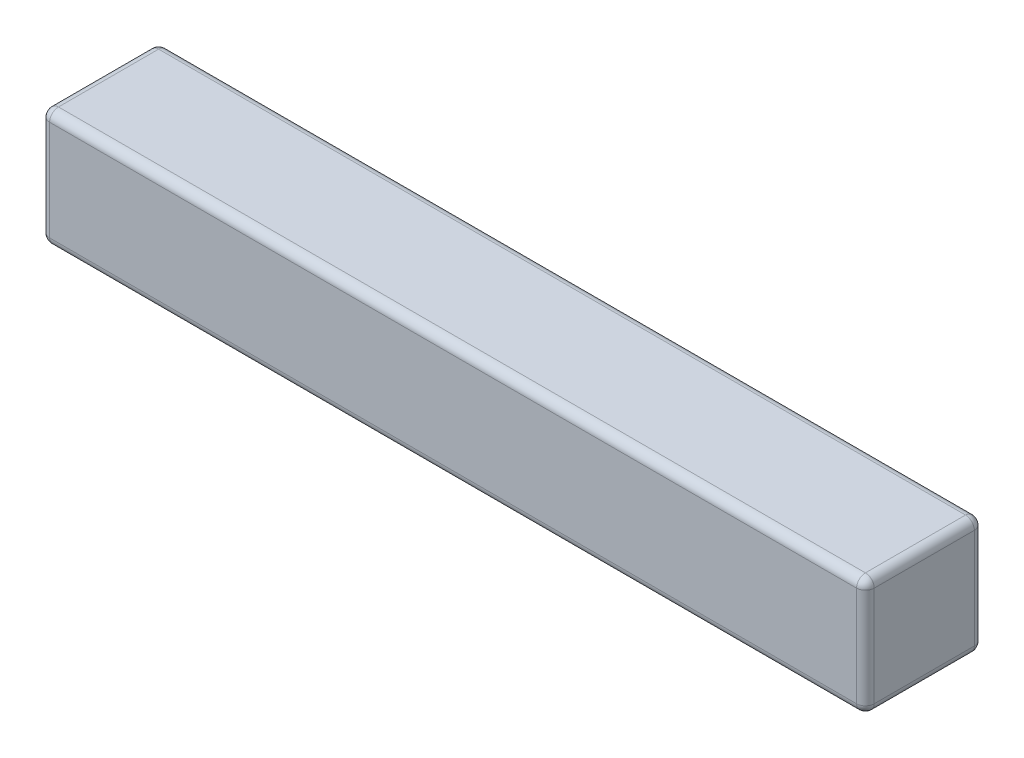
ISO-10303-21;
HEADER;
FILE_DESCRIPTION(('STEP AP214'),'2;1');
FILE_NAME('part.step','',(''),(''),'','','');
FILE_SCHEMA(('AUTOMOTIVE_DESIGN { 1 0 10303 214 1 1 1 1 }'));
ENDSEC;
DATA;
#1=APPLICATION_CONTEXT('core data for automotive mechanical design processes');
#2=APPLICATION_PROTOCOL_DEFINITION('international standard','automotive_design',2000,#1);
#3=PRODUCT_CONTEXT('',#1,'mechanical');
#4=PRODUCT('Part','Part','',(#3));
#5=PRODUCT_RELATED_PRODUCT_CATEGORY('part','',(#4));
#6=PRODUCT_DEFINITION_FORMATION('','',#4);
#7=PRODUCT_DEFINITION_CONTEXT('part definition',#1,'design');
#8=PRODUCT_DEFINITION('design','',#6,#7);
#9=PRODUCT_DEFINITION_SHAPE('','',#8);
#10=(LENGTH_UNIT() NAMED_UNIT(*) SI_UNIT(.MILLI.,.METRE.));
#11=(NAMED_UNIT(*) PLANE_ANGLE_UNIT() SI_UNIT($,.RADIAN.));
#12=(NAMED_UNIT(*) SI_UNIT($,.STERADIAN.) SOLID_ANGLE_UNIT());
#13=UNCERTAINTY_MEASURE_WITH_UNIT(LENGTH_MEASURE(1.E-05),#10,'distance_accuracy_value','');
#14=(GEOMETRIC_REPRESENTATION_CONTEXT(3) GLOBAL_UNCERTAINTY_ASSIGNED_CONTEXT((#13)) GLOBAL_UNIT_ASSIGNED_CONTEXT((#10,
#11,#12)) REPRESENTATION_CONTEXT('',''));
#15=CARTESIAN_POINT('',(0.,0.,0.));
#16=DIRECTION('',(0.,0.,1.));
#17=DIRECTION('',(1.,0.,0.));
#18=AXIS2_PLACEMENT_3D('',#15,#16,#17);
#19=CARTESIAN_POINT('',(13.85,-1.85,-3.2542396313364));
#20=DIRECTION('',(1.,0.,0.));
#21=DIRECTION('',(0.,1.,0.));
#22=AXIS2_PLACEMENT_3D('',#19,#20,#21);
#23=SPHERICAL_SURFACE('',#22,0.15);
#24=CARTESIAN_POINT('',(13.85,-1.85,-3.2542396313364));
#25=DIRECTION('',(-1.,0.,0.));
#26=DIRECTION('',(0.,0.,1.));
#27=AXIS2_PLACEMENT_3D('',#24,#25,#26);
#28=CIRCLE('',#27,0.15);
#29=CARTESIAN_POINT('',(13.85,-1.85,-3.4042396313364));
#30=VERTEX_POINT('',#29);
#31=CARTESIAN_POINT('',(13.85,-2.,-3.25423963133563));
#32=VERTEX_POINT('',#31);
#33=EDGE_CURVE('E464',#30,#32,#28,.T.);
#34=ORIENTED_EDGE('',*,*,#33,.F.);
#35=CARTESIAN_POINT('',(13.85,-1.85,-3.2542396313364));
#36=DIRECTION('',(0.,-1.,0.));
#37=DIRECTION('',(0.,0.,-1.));
#38=AXIS2_PLACEMENT_3D('',#35,#36,#37);
#39=CIRCLE('',#38,0.15);
#40=CARTESIAN_POINT('',(14.,-1.85,-3.2542396313364));
#41=VERTEX_POINT('',#40);
#42=EDGE_CURVE('E461',#41,#30,#39,.F.);
#43=ORIENTED_EDGE('',*,*,#42,.F.);
#44=CARTESIAN_POINT('',(13.85,-1.85,-3.2542396313364));
#45=DIRECTION('',(0.,0.,-1.));
#46=DIRECTION('',(-1.,0.,0.));
#47=AXIS2_PLACEMENT_3D('',#44,#45,#46);
#48=CIRCLE('',#47,0.15);
#49=EDGE_CURVE('E102',#32,#41,#48,.F.);
#50=ORIENTED_EDGE('',*,*,#49,.F.);
#51=EDGE_LOOP('',(#34,#43,#50));
#52=FACE_BOUND('',#51,.T.);
#53=ADVANCED_FACE('F16',(#52),#23,.T.);
#54=CARTESIAN_POINT('',(0.15,-1.85,-3.2542396313364));
#55=DIRECTION('',(1.,0.,0.));
#56=DIRECTION('',(0.,1.,0.));
#57=AXIS2_PLACEMENT_3D('',#54,#55,#56);
#58=SPHERICAL_SURFACE('',#57,0.15);
#59=CARTESIAN_POINT('',(0.15,-1.85,-3.2542396313364));
#60=DIRECTION('',(0.,0.,1.));
#61=DIRECTION('',(1.,0.,0.));
#62=AXIS2_PLACEMENT_3D('',#59,#60,#61);
#63=CIRCLE('',#62,0.15);
#64=CARTESIAN_POINT('',(0.,-1.85,-3.2542396313364));
#65=VERTEX_POINT('',#64);
#66=CARTESIAN_POINT('',(0.150000000000001,-2.,-3.2542396313364));
#67=VERTEX_POINT('',#66);
#68=EDGE_CURVE('E476',#65,#67,#63,.T.);
#69=ORIENTED_EDGE('',*,*,#68,.F.);
#70=CARTESIAN_POINT('',(0.150000000000001,-1.85,-3.2542396313364));
#71=DIRECTION('',(0.,-1.,0.));
#72=DIRECTION('',(0.,0.,-1.));
#73=AXIS2_PLACEMENT_3D('',#70,#71,#72);
#74=CIRCLE('',#73,0.15);
#75=CARTESIAN_POINT('',(0.150000000000001,-1.85000000000077,-3.4042396313364));
#76=VERTEX_POINT('',#75);
#77=EDGE_CURVE('E409',#76,#65,#74,.F.);
#78=ORIENTED_EDGE('',*,*,#77,.F.);
#79=CARTESIAN_POINT('',(0.150000000000001,-1.85,-3.2542396313364));
#80=DIRECTION('',(-1.,0.,0.));
#81=DIRECTION('',(0.,0.,1.));
#82=AXIS2_PLACEMENT_3D('',#79,#80,#81);
#83=CIRCLE('',#82,0.15);
#84=EDGE_CURVE('E465',#67,#76,#83,.F.);
#85=ORIENTED_EDGE('',*,*,#84,.F.);
#86=EDGE_LOOP('',(#69,#78,#85));
#87=FACE_BOUND('',#86,.T.);
#88=ADVANCED_FACE('F156',(#87),#58,.T.);
#89=CARTESIAN_POINT('',(13.85,-1.85,-1.5542396313364));
#90=DIRECTION('',(1.,0.,0.));
#91=DIRECTION('',(0.,1.,0.));
#92=AXIS2_PLACEMENT_3D('',#89,#90,#91);
#93=SPHERICAL_SURFACE('',#92,0.15);
#94=CARTESIAN_POINT('',(13.85,-1.85,-1.5542396313364));
#95=DIRECTION('',(1.,0.,0.));
#96=DIRECTION('',(0.,0.,-1.));
#97=AXIS2_PLACEMENT_3D('',#94,#95,#96);
#98=CIRCLE('',#97,0.15);
#99=CARTESIAN_POINT('',(13.85,-2.,-1.5542396313364));
#100=VERTEX_POINT('',#99);
#101=CARTESIAN_POINT('',(13.85,-1.84999999999923,-1.4042396313364));
#102=VERTEX_POINT('',#101);
#103=EDGE_CURVE('E127',#100,#102,#98,.F.);
#104=ORIENTED_EDGE('',*,*,#103,.F.);
#105=CARTESIAN_POINT('',(13.85,-1.85,-1.5542396313364));
#106=DIRECTION('',(0.,0.,-1.));
#107=DIRECTION('',(-1.,0.,0.));
#108=AXIS2_PLACEMENT_3D('',#105,#106,#107);
#109=CIRCLE('',#108,0.15);
#110=CARTESIAN_POINT('',(14.,-1.85,-1.5542396313364));
#111=VERTEX_POINT('',#110);
#112=EDGE_CURVE('E119',#111,#100,#109,.T.);
#113=ORIENTED_EDGE('',*,*,#112,.F.);
#114=CARTESIAN_POINT('',(13.85,-1.85,-1.5542396313364));
#115=DIRECTION('',(0.,-1.,0.));
#116=DIRECTION('',(0.,0.,-1.));
#117=AXIS2_PLACEMENT_3D('',#114,#115,#116);
#118=CIRCLE('',#117,0.15);
#119=EDGE_CURVE('E136',#102,#111,#118,.F.);
#120=ORIENTED_EDGE('',*,*,#119,.F.);
#121=EDGE_LOOP('',(#104,#113,#120));
#122=FACE_BOUND('',#121,.T.);
#123=ADVANCED_FACE('F133',(#122),#93,.T.);
#124=CARTESIAN_POINT('',(0.15,-1.85,-1.5542396313364));
#125=DIRECTION('',(1.,0.,0.));
#126=DIRECTION('',(0.,1.,0.));
#127=AXIS2_PLACEMENT_3D('',#124,#125,#126);
#128=SPHERICAL_SURFACE('',#127,0.15);
#129=CARTESIAN_POINT('',(0.15,-1.85,-1.5542396313364));
#130=DIRECTION('',(1.,0.,0.));
#131=DIRECTION('',(0.,0.,-1.));
#132=AXIS2_PLACEMENT_3D('',#129,#130,#131);
#133=CIRCLE('',#132,0.15);
#134=CARTESIAN_POINT('',(0.15,-1.85,-1.4042396313364));
#135=VERTEX_POINT('',#134);
#136=CARTESIAN_POINT('',(0.15,-2.,-1.55423963133602));
#137=VERTEX_POINT('',#136);
#138=EDGE_CURVE('E129',#135,#137,#133,.T.);
#139=ORIENTED_EDGE('',*,*,#138,.F.);
#140=CARTESIAN_POINT('',(0.15,-1.85,-1.5542396313364));
#141=DIRECTION('',(0.,-1.,0.));
#142=DIRECTION('',(0.,0.,-1.));
#143=AXIS2_PLACEMENT_3D('',#140,#141,#142);
#144=CIRCLE('',#143,0.15);
#145=CARTESIAN_POINT('',(0.,-1.85,-1.5542396313364));
#146=VERTEX_POINT('',#145);
#147=EDGE_CURVE('E138',#146,#135,#144,.F.);
#148=ORIENTED_EDGE('',*,*,#147,.F.);
#149=CARTESIAN_POINT('',(0.15,-1.85,-1.5542396313364));
#150=DIRECTION('',(0.,0.,1.));
#151=DIRECTION('',(1.,0.,0.));
#152=AXIS2_PLACEMENT_3D('',#149,#150,#151);
#153=CIRCLE('',#152,0.15);
#154=EDGE_CURVE('E468',#137,#146,#153,.F.);
#155=ORIENTED_EDGE('',*,*,#154,.F.);
#156=EDGE_LOOP('',(#139,#148,#155));
#157=FACE_BOUND('',#156,.T.);
#158=ADVANCED_FACE('F149',(#157),#128,.T.);
#159=CARTESIAN_POINT('',(0.,-2.,-1.4042396313364));
#160=DIRECTION('',(0.,1.,0.));
#161=DIRECTION('',(0.,0.,1.));
#162=AXIS2_PLACEMENT_3D('',#159,#160,#161);
#163=PLANE('',#162);
#164=DIRECTION('',(-1.,0.,0.));
#165=VECTOR('',#164,1.);
#166=CARTESIAN_POINT('',(14.,-2.,-3.2542396313364));
#167=LINE('',#166,#165);
#168=EDGE_CURVE('E116',#32,#67,#167,.T.);
#169=ORIENTED_EDGE('',*,*,#168,.F.);
#170=DIRECTION('',(0.,0.,-1.));
#171=VECTOR('',#170,1.);
#172=CARTESIAN_POINT('',(13.85,-2.,-1.4042396313364));
#173=LINE('',#172,#171);
#174=EDGE_CURVE('E109',#100,#32,#173,.T.);
#175=ORIENTED_EDGE('',*,*,#174,.F.);
#176=DIRECTION('',(1.,0.,0.));
#177=VECTOR('',#176,1.);
#178=CARTESIAN_POINT('',(0.,-2.,-1.5542396313364));
#179=LINE('',#178,#177);
#180=EDGE_CURVE('E113',#137,#100,#179,.T.);
#181=ORIENTED_EDGE('',*,*,#180,.F.);
#182=DIRECTION('',(0.,0.,1.));
#183=VECTOR('',#182,1.);
#184=CARTESIAN_POINT('',(0.15,-2.,-3.4042396313364));
#185=LINE('',#184,#183);
#186=EDGE_CURVE('E478',#67,#137,#185,.T.);
#187=ORIENTED_EDGE('',*,*,#186,.F.);
#188=EDGE_LOOP('',(#169,#175,#181,#187));
#189=FACE_BOUND('',#188,.T.);
#190=ADVANCED_FACE('F111',(#189),#163,.F.);
#191=CARTESIAN_POINT('',(13.85,-1.85,-1.4042396313364));
#192=DIRECTION('',(0.,0.,-1.));
#193=DIRECTION('',(-1.,0.,0.));
#194=AXIS2_PLACEMENT_3D('',#191,#192,#193);
#195=CYLINDRICAL_SURFACE('',#194,0.15);
#196=ORIENTED_EDGE('',*,*,#49,.T.);
#197=DIRECTION('',(0.,0.,-1.));
#198=VECTOR('',#197,1.);
#199=CARTESIAN_POINT('',(14.,-1.85,-1.4042396313364));
#200=LINE('',#199,#198);
#201=EDGE_CURVE('E130',#111,#41,#200,.T.);
#202=ORIENTED_EDGE('',*,*,#201,.F.);
#203=ORIENTED_EDGE('',*,*,#112,.T.);
#204=ORIENTED_EDGE('',*,*,#174,.T.);
#205=EDGE_LOOP('',(#196,#202,#203,#204));
#206=FACE_BOUND('',#205,.T.);
#207=ADVANCED_FACE('F140',(#206),#195,.T.);
#208=CARTESIAN_POINT('',(13.85,-2.,-3.2542396313364));
#209=DIRECTION('',(0.,-1.,0.));
#210=DIRECTION('',(0.,0.,-1.));
#211=AXIS2_PLACEMENT_3D('',#208,#209,#210);
#212=CYLINDRICAL_SURFACE('',#211,0.15);
#213=CARTESIAN_POINT('',(13.85,-0.15,-3.2542396313364));
#214=DIRECTION('',(0.,1.,0.));
#215=DIRECTION('',(1.,0.,0.));
#216=AXIS2_PLACEMENT_3D('',#213,#214,#215);
#217=CIRCLE('',#216,0.15);
#218=CARTESIAN_POINT('',(14.,-0.15,-3.2542396313364));
#219=VERTEX_POINT('',#218);
#220=CARTESIAN_POINT('',(13.85,-0.15,-3.4042396313364));
#221=VERTEX_POINT('',#220);
#222=EDGE_CURVE('E243',#219,#221,#217,.T.);
#223=ORIENTED_EDGE('',*,*,#222,.F.);
#224=DIRECTION('',(0.,1.,0.));
#225=VECTOR('',#224,1.);
#226=CARTESIAN_POINT('',(14.,-2.,-3.2542396313364));
#227=LINE('',#226,#225);
#228=EDGE_CURVE('E443',#41,#219,#227,.T.);
#229=ORIENTED_EDGE('',*,*,#228,.F.);
#230=ORIENTED_EDGE('',*,*,#42,.T.);
#231=DIRECTION('',(0.,1.,0.));
#232=VECTOR('',#231,1.);
#233=CARTESIAN_POINT('',(13.85,-2.,-3.4042396313364));
#234=LINE('',#233,#232);
#235=EDGE_CURVE('E237',#221,#30,#234,.F.);
#236=ORIENTED_EDGE('',*,*,#235,.F.);
#237=EDGE_LOOP('',(#223,#229,#230,#236));
#238=FACE_BOUND('',#237,.T.);
#239=ADVANCED_FACE('F276',(#238),#212,.T.);
#240=CARTESIAN_POINT('',(14.,-1.85,-3.2542396313364));
#241=DIRECTION('',(-1.,0.,0.));
#242=DIRECTION('',(0.,0.,1.));
#243=AXIS2_PLACEMENT_3D('',#240,#241,#242);
#244=CYLINDRICAL_SURFACE('',#243,0.15);
#245=ORIENTED_EDGE('',*,*,#84,.T.);
#246=DIRECTION('',(-1.,0.,0.));
#247=VECTOR('',#246,1.);
#248=CARTESIAN_POINT('',(14.,-1.85,-3.4042396313364));
#249=LINE('',#248,#247);
#250=EDGE_CURVE('E234',#30,#76,#249,.T.);
#251=ORIENTED_EDGE('',*,*,#250,.F.);
#252=ORIENTED_EDGE('',*,*,#33,.T.);
#253=ORIENTED_EDGE('',*,*,#168,.T.);
#254=EDGE_LOOP('',(#245,#251,#252,#253));
#255=FACE_BOUND('',#254,.T.);
#256=ADVANCED_FACE('F272',(#255),#244,.T.);
#257=CARTESIAN_POINT('',(0.150000000000001,-2.,-3.2542396313364));
#258=DIRECTION('',(0.,-1.,0.));
#259=DIRECTION('',(0.,0.,-1.));
#260=AXIS2_PLACEMENT_3D('',#257,#258,#259);
#261=CYLINDRICAL_SURFACE('',#260,0.15);
#262=CARTESIAN_POINT('',(0.15,-0.15,-3.2542396313364));
#263=DIRECTION('',(0.,1.,0.));
#264=DIRECTION('',(1.,0.,0.));
#265=AXIS2_PLACEMENT_3D('',#262,#263,#264);
#266=CIRCLE('',#265,0.15);
#267=CARTESIAN_POINT('',(0.150000000000001,-0.15,-3.4042396313364));
#268=VERTEX_POINT('',#267);
#269=CARTESIAN_POINT('',(0.,-0.15,-3.2542396313364));
#270=VERTEX_POINT('',#269);
#271=EDGE_CURVE('E231',#268,#270,#266,.T.);
#272=ORIENTED_EDGE('',*,*,#271,.F.);
#273=DIRECTION('',(0.,1.,0.));
#274=VECTOR('',#273,1.);
#275=CARTESIAN_POINT('',(0.150000000000001,-2.,-3.4042396313364));
#276=LINE('',#275,#274);
#277=EDGE_CURVE('E240',#76,#268,#276,.T.);
#278=ORIENTED_EDGE('',*,*,#277,.F.);
#279=ORIENTED_EDGE('',*,*,#77,.T.);
#280=DIRECTION('',(0.,1.,0.));
#281=VECTOR('',#280,1.);
#282=CARTESIAN_POINT('',(0.,-2.,-3.2542396313364));
#283=LINE('',#282,#281);
#284=EDGE_CURVE('E229',#270,#65,#283,.F.);
#285=ORIENTED_EDGE('',*,*,#284,.F.);
#286=EDGE_LOOP('',(#272,#278,#279,#285));
#287=FACE_BOUND('',#286,.T.);
#288=ADVANCED_FACE('F268',(#287),#261,.T.);
#289=CARTESIAN_POINT('',(0.15,-1.85,-3.4042396313364));
#290=DIRECTION('',(0.,0.,1.));
#291=DIRECTION('',(1.,0.,0.));
#292=AXIS2_PLACEMENT_3D('',#289,#290,#291);
#293=CYLINDRICAL_SURFACE('',#292,0.15);
#294=ORIENTED_EDGE('',*,*,#68,.T.);
#295=ORIENTED_EDGE('',*,*,#186,.T.);
#296=ORIENTED_EDGE('',*,*,#154,.T.);
#297=DIRECTION('',(0.,0.,1.));
#298=VECTOR('',#297,1.);
#299=CARTESIAN_POINT('',(0.,-1.85,-3.4042396313364));
#300=LINE('',#299,#298);
#301=EDGE_CURVE('E399',#65,#146,#300,.T.);
#302=ORIENTED_EDGE('',*,*,#301,.F.);
#303=EDGE_LOOP('',(#294,#295,#296,#302));
#304=FACE_BOUND('',#303,.T.);
#305=ADVANCED_FACE('F264',(#304),#293,.T.);
#306=CARTESIAN_POINT('',(13.85,-2.,-1.5542396313364));
#307=DIRECTION('',(0.,-1.,0.));
#308=DIRECTION('',(0.,0.,-1.));
#309=AXIS2_PLACEMENT_3D('',#306,#307,#308);
#310=CYLINDRICAL_SURFACE('',#309,0.15);
#311=CARTESIAN_POINT('',(13.85,-0.15,-1.5542396313364));
#312=DIRECTION('',(0.,-1.,0.));
#313=DIRECTION('',(0.,0.,-1.));
#314=AXIS2_PLACEMENT_3D('',#311,#312,#313);
#315=CIRCLE('',#314,0.15);
#316=CARTESIAN_POINT('',(14.,-0.15,-1.5542396313364));
#317=VERTEX_POINT('',#316);
#318=CARTESIAN_POINT('',(13.85,-0.15,-1.4042396313364));
#319=VERTEX_POINT('',#318);
#320=EDGE_CURVE('E438',#317,#319,#315,.T.);
#321=ORIENTED_EDGE('',*,*,#320,.T.);
#322=DIRECTION('',(0.,1.,0.));
#323=VECTOR('',#322,1.);
#324=CARTESIAN_POINT('',(13.85,-2.,-1.4042396313364));
#325=LINE('',#324,#323);
#326=EDGE_CURVE('E205',#102,#319,#325,.T.);
#327=ORIENTED_EDGE('',*,*,#326,.F.);
#328=ORIENTED_EDGE('',*,*,#119,.T.);
#329=DIRECTION('',(0.,1.,0.));
#330=VECTOR('',#329,1.);
#331=CARTESIAN_POINT('',(14.,-2.,-1.5542396313364));
#332=LINE('',#331,#330);
#333=EDGE_CURVE('E442',#317,#111,#332,.F.);
#334=ORIENTED_EDGE('',*,*,#333,.F.);
#335=EDGE_LOOP('',(#321,#327,#328,#334));
#336=FACE_BOUND('',#335,.T.);
#337=ADVANCED_FACE('F260',(#336),#310,.T.);
#338=CARTESIAN_POINT('',(0.15,-2.,-1.5542396313364));
#339=DIRECTION('',(0.,-1.,0.));
#340=DIRECTION('',(0.,0.,-1.));
#341=AXIS2_PLACEMENT_3D('',#338,#339,#340);
#342=CYLINDRICAL_SURFACE('',#341,0.15);
#343=CARTESIAN_POINT('',(0.15,-0.15,-1.5542396313364));
#344=DIRECTION('',(0.,-1.,0.));
#345=DIRECTION('',(1.,0.,0.));
#346=AXIS2_PLACEMENT_3D('',#343,#344,#345);
#347=CIRCLE('',#346,0.15);
#348=CARTESIAN_POINT('',(0.,-0.15,-1.5542396313364));
#349=VERTEX_POINT('',#348);
#350=CARTESIAN_POINT('',(0.15,-0.15,-1.4042396313364));
#351=VERTEX_POINT('',#350);
#352=EDGE_CURVE('E208',#349,#351,#347,.F.);
#353=ORIENTED_EDGE('',*,*,#352,.F.);
#354=DIRECTION('',(0.,1.,0.));
#355=VECTOR('',#354,1.);
#356=CARTESIAN_POINT('',(0.,-2.,-1.5542396313364));
#357=LINE('',#356,#355);
#358=EDGE_CURVE('E398',#146,#349,#357,.T.);
#359=ORIENTED_EDGE('',*,*,#358,.F.);
#360=ORIENTED_EDGE('',*,*,#147,.T.);
#361=DIRECTION('',(0.,1.,0.));
#362=VECTOR('',#361,1.);
#363=CARTESIAN_POINT('',(0.15,-2.,-1.4042396313364));
#364=LINE('',#363,#362);
#365=EDGE_CURVE('E202',#351,#135,#364,.F.);
#366=ORIENTED_EDGE('',*,*,#365,.F.);
#367=EDGE_LOOP('',(#353,#359,#360,#366));
#368=FACE_BOUND('',#367,.T.);
#369=ADVANCED_FACE('F257',(#368),#342,.T.);
#370=CARTESIAN_POINT('',(0.,-1.85,-1.5542396313364));
#371=DIRECTION('',(1.,0.,0.));
#372=DIRECTION('',(0.,0.,-1.));
#373=AXIS2_PLACEMENT_3D('',#370,#371,#372);
#374=CYLINDRICAL_SURFACE('',#373,0.15);
#375=ORIENTED_EDGE('',*,*,#138,.T.);
#376=ORIENTED_EDGE('',*,*,#180,.T.);
#377=ORIENTED_EDGE('',*,*,#103,.T.);
#378=DIRECTION('',(1.,0.,0.));
#379=VECTOR('',#378,1.);
#380=CARTESIAN_POINT('',(0.,-1.85,-1.4042396313364));
#381=LINE('',#380,#379);
#382=EDGE_CURVE('E200',#135,#102,#381,.T.);
#383=ORIENTED_EDGE('',*,*,#382,.F.);
#384=EDGE_LOOP('',(#375,#376,#377,#383));
#385=FACE_BOUND('',#384,.T.);
#386=ADVANCED_FACE('F125',(#385),#374,.T.);
#387=CARTESIAN_POINT('',(14.,-2.,-1.4042396313364));
#388=DIRECTION('',(1.,0.,0.));
#389=DIRECTION('',(0.,0.,-1.));
#390=AXIS2_PLACEMENT_3D('',#387,#388,#389);
#391=PLANE('',#390);
#392=DIRECTION('',(0.,0.,1.));
#393=VECTOR('',#392,1.);
#394=CARTESIAN_POINT('',(14.,-0.15,-1.4042396313364));
#395=LINE('',#394,#393);
#396=EDGE_CURVE('E428',#317,#219,#395,.F.);
#397=ORIENTED_EDGE('',*,*,#396,.F.);
#398=ORIENTED_EDGE('',*,*,#333,.T.);
#399=ORIENTED_EDGE('',*,*,#201,.T.);
#400=ORIENTED_EDGE('',*,*,#228,.T.);
#401=EDGE_LOOP('',(#397,#398,#399,#400));
#402=FACE_BOUND('',#401,.T.);
#403=ADVANCED_FACE('F250',(#402),#391,.T.);
#404=CARTESIAN_POINT('',(13.85,-0.15,-3.2542396313364));
#405=DIRECTION('',(1.,0.,0.));
#406=DIRECTION('',(0.,1.,0.));
#407=AXIS2_PLACEMENT_3D('',#404,#405,#406);
#408=SPHERICAL_SURFACE('',#407,0.15);
#409=ORIENTED_EDGE('',*,*,#222,.T.);
#410=CARTESIAN_POINT('',(13.85,-0.15,-3.2542396313364));
#411=DIRECTION('',(1.,0.,0.));
#412=DIRECTION('',(0.,0.,-1.));
#413=AXIS2_PLACEMENT_3D('',#410,#411,#412);
#414=CIRCLE('',#413,0.15);
#415=CARTESIAN_POINT('',(13.85,0.,-3.2542396313364));
#416=VERTEX_POINT('',#415);
#417=EDGE_CURVE('E421',#416,#221,#414,.F.);
#418=ORIENTED_EDGE('',*,*,#417,.F.);
#419=CARTESIAN_POINT('',(13.85,-0.15,-3.2542396313364));
#420=DIRECTION('',(0.,0.,1.));
#421=DIRECTION('',(1.,0.,0.));
#422=AXIS2_PLACEMENT_3D('',#419,#420,#421);
#423=CIRCLE('',#422,0.15);
#424=EDGE_CURVE('E423',#219,#416,#423,.T.);
#425=ORIENTED_EDGE('',*,*,#424,.F.);
#426=EDGE_LOOP('',(#409,#418,#425));
#427=FACE_BOUND('',#426,.T.);
#428=ADVANCED_FACE('F247',(#427),#408,.T.);
#429=CARTESIAN_POINT('',(14.,-2.,-3.4042396313364));
#430=DIRECTION('',(0.,0.,-1.));
#431=DIRECTION('',(-1.,0.,0.));
#432=AXIS2_PLACEMENT_3D('',#429,#430,#431);
#433=PLANE('',#432);
#434=ORIENTED_EDGE('',*,*,#235,.T.);
#435=ORIENTED_EDGE('',*,*,#250,.T.);
#436=ORIENTED_EDGE('',*,*,#277,.T.);
#437=DIRECTION('',(1.,0.,0.));
#438=VECTOR('',#437,1.);
#439=CARTESIAN_POINT('',(0.,-0.15,-3.4042396313364));
#440=LINE('',#439,#438);
#441=EDGE_CURVE('E417',#221,#268,#440,.F.);
#442=ORIENTED_EDGE('',*,*,#441,.F.);
#443=EDGE_LOOP('',(#434,#435,#436,#442));
#444=FACE_BOUND('',#443,.T.);
#445=ADVANCED_FACE('F223',(#444),#433,.T.);
#446=CARTESIAN_POINT('',(0.15,-0.15,-3.2542396313364));
#447=DIRECTION('',(1.,0.,0.));
#448=DIRECTION('',(0.,1.,0.));
#449=AXIS2_PLACEMENT_3D('',#446,#447,#448);
#450=SPHERICAL_SURFACE('',#449,0.15);
#451=CARTESIAN_POINT('',(0.15,-0.15,-3.2542396313364));
#452=DIRECTION('',(0.,0.,-1.));
#453=DIRECTION('',(-1.,0.,0.));
#454=AXIS2_PLACEMENT_3D('',#451,#452,#453);
#455=CIRCLE('',#454,0.15);
#456=CARTESIAN_POINT('',(0.15,0.,-3.2542396313364));
#457=VERTEX_POINT('',#456);
#458=EDGE_CURVE('E411',#457,#270,#455,.F.);
#459=ORIENTED_EDGE('',*,*,#458,.F.);
#460=CARTESIAN_POINT('',(0.150000000000001,-0.15,-3.2542396313364));
#461=DIRECTION('',(1.,0.,0.));
#462=DIRECTION('',(0.,0.,-1.));
#463=AXIS2_PLACEMENT_3D('',#460,#461,#462);
#464=CIRCLE('',#463,0.15);
#465=EDGE_CURVE('E413',#268,#457,#464,.T.);
#466=ORIENTED_EDGE('',*,*,#465,.F.);
#467=ORIENTED_EDGE('',*,*,#271,.T.);
#468=EDGE_LOOP('',(#459,#466,#467));
#469=FACE_BOUND('',#468,.T.);
#470=ADVANCED_FACE('F218',(#469),#450,.T.);
#471=CARTESIAN_POINT('',(0.,-2.,-3.4042396313364));
#472=DIRECTION('',(-1.,0.,0.));
#473=DIRECTION('',(0.,0.,1.));
#474=AXIS2_PLACEMENT_3D('',#471,#472,#473);
#475=PLANE('',#474);
#476=ORIENTED_EDGE('',*,*,#301,.T.);
#477=ORIENTED_EDGE('',*,*,#358,.T.);
#478=DIRECTION('',(0.,0.,-1.));
#479=VECTOR('',#478,1.);
#480=CARTESIAN_POINT('',(0.,-0.15,-1.4042396313364));
#481=LINE('',#480,#479);
#482=EDGE_CURVE('E405',#270,#349,#481,.F.);
#483=ORIENTED_EDGE('',*,*,#482,.F.);
#484=ORIENTED_EDGE('',*,*,#284,.T.);
#485=EDGE_LOOP('',(#476,#477,#483,#484));
#486=FACE_BOUND('',#485,.T.);
#487=ADVANCED_FACE('F215',(#486),#475,.T.);
#488=CARTESIAN_POINT('',(0.15,-0.15,-1.5542396313364));
#489=DIRECTION('',(1.,0.,0.));
#490=DIRECTION('',(0.,1.,0.));
#491=AXIS2_PLACEMENT_3D('',#488,#489,#490);
#492=SPHERICAL_SURFACE('',#491,0.15);
#493=CARTESIAN_POINT('',(0.15,-0.15,-1.5542396313364));
#494=DIRECTION('',(-1.,0.,0.));
#495=DIRECTION('',(0.,0.,1.));
#496=AXIS2_PLACEMENT_3D('',#493,#494,#495);
#497=CIRCLE('',#496,0.15);
#498=CARTESIAN_POINT('',(0.15,0.,-1.5542396313364));
#499=VERTEX_POINT('',#498);
#500=EDGE_CURVE('E34',#499,#351,#497,.F.);
#501=ORIENTED_EDGE('',*,*,#500,.F.);
#502=CARTESIAN_POINT('',(0.15,-0.15,-1.5542396313364));
#503=DIRECTION('',(0.,0.,-1.));
#504=DIRECTION('',(-1.,0.,0.));
#505=AXIS2_PLACEMENT_3D('',#502,#503,#504);
#506=CIRCLE('',#505,0.15);
#507=EDGE_CURVE('E396',#349,#499,#506,.T.);
#508=ORIENTED_EDGE('',*,*,#507,.F.);
#509=ORIENTED_EDGE('',*,*,#352,.T.);
#510=EDGE_LOOP('',(#501,#508,#509));
#511=FACE_BOUND('',#510,.T.);
#512=ADVANCED_FACE('F212',(#511),#492,.T.);
#513=CARTESIAN_POINT('',(0.,-2.,-1.4042396313364));
#514=DIRECTION('',(0.,0.,1.));
#515=DIRECTION('',(1.,0.,0.));
#516=AXIS2_PLACEMENT_3D('',#513,#514,#515);
#517=PLANE('',#516);
#518=ORIENTED_EDGE('',*,*,#365,.T.);
#519=ORIENTED_EDGE('',*,*,#382,.T.);
#520=ORIENTED_EDGE('',*,*,#326,.T.);
#521=DIRECTION('',(-1.,0.,0.));
#522=VECTOR('',#521,1.);
#523=CARTESIAN_POINT('',(0.,-0.15,-1.4042396313364));
#524=LINE('',#523,#522);
#525=EDGE_CURVE('E393',#351,#319,#524,.F.);
#526=ORIENTED_EDGE('',*,*,#525,.F.);
#527=EDGE_LOOP('',(#518,#519,#520,#526));
#528=FACE_BOUND('',#527,.T.);
#529=ADVANCED_FACE('F192',(#528),#517,.T.);
#530=CARTESIAN_POINT('',(13.85,-0.15,-1.5542396313364));
#531=DIRECTION('',(1.,0.,0.));
#532=DIRECTION('',(0.,1.,0.));
#533=AXIS2_PLACEMENT_3D('',#530,#531,#532);
#534=SPHERICAL_SURFACE('',#533,0.15);
#535=ORIENTED_EDGE('',*,*,#320,.F.);
#536=CARTESIAN_POINT('',(13.85,-0.15,-1.5542396313364));
#537=DIRECTION('',(0.,0.,1.));
#538=DIRECTION('',(1.,0.,0.));
#539=AXIS2_PLACEMENT_3D('',#536,#537,#538);
#540=CIRCLE('',#539,0.15);
#541=CARTESIAN_POINT('',(13.85,0.,-1.5542396313364));
#542=VERTEX_POINT('',#541);
#543=EDGE_CURVE('E198',#542,#317,#540,.F.);
#544=ORIENTED_EDGE('',*,*,#543,.F.);
#545=CARTESIAN_POINT('',(13.85,-0.15,-1.5542396313364));
#546=DIRECTION('',(-1.,0.,0.));
#547=DIRECTION('',(0.,0.,1.));
#548=AXIS2_PLACEMENT_3D('',#545,#546,#547);
#549=CIRCLE('',#548,0.15);
#550=EDGE_CURVE('E437',#319,#542,#549,.T.);
#551=ORIENTED_EDGE('',*,*,#550,.F.);
#552=EDGE_LOOP('',(#535,#544,#551));
#553=FACE_BOUND('',#552,.T.);
#554=ADVANCED_FACE('F187',(#553),#534,.T.);
#555=CARTESIAN_POINT('',(13.85,-0.15,-1.4042396313364));
#556=DIRECTION('',(0.,0.,1.));
#557=DIRECTION('',(1.,0.,0.));
#558=AXIS2_PLACEMENT_3D('',#555,#556,#557);
#559=CYLINDRICAL_SURFACE('',#558,0.15);
#560=ORIENTED_EDGE('',*,*,#424,.T.);
#561=DIRECTION('',(0.,0.,1.));
#562=VECTOR('',#561,1.);
#563=CARTESIAN_POINT('',(13.85,0.,-1.4042396313364));
#564=LINE('',#563,#562);
#565=EDGE_CURVE('E434',#542,#416,#564,.F.);
#566=ORIENTED_EDGE('',*,*,#565,.F.);
#567=ORIENTED_EDGE('',*,*,#543,.T.);
#568=ORIENTED_EDGE('',*,*,#396,.T.);
#569=EDGE_LOOP('',(#560,#566,#567,#568));
#570=FACE_BOUND('',#569,.T.);
#571=ADVANCED_FACE('F183',(#570),#559,.T.);
#572=CARTESIAN_POINT('',(0.,-0.15,-3.2542396313364));
#573=DIRECTION('',(1.,0.,0.));
#574=DIRECTION('',(0.,0.,-1.));
#575=AXIS2_PLACEMENT_3D('',#572,#573,#574);
#576=CYLINDRICAL_SURFACE('',#575,0.15);
#577=ORIENTED_EDGE('',*,*,#465,.T.);
#578=DIRECTION('',(1.,0.,0.));
#579=VECTOR('',#578,1.);
#580=CARTESIAN_POINT('',(0.,0.,-3.2542396313364));
#581=LINE('',#580,#579);
#582=EDGE_CURVE('E451',#416,#457,#581,.F.);
#583=ORIENTED_EDGE('',*,*,#582,.F.);
#584=ORIENTED_EDGE('',*,*,#417,.T.);
#585=ORIENTED_EDGE('',*,*,#441,.T.);
#586=EDGE_LOOP('',(#577,#583,#584,#585));
#587=FACE_BOUND('',#586,.T.);
#588=ADVANCED_FACE('F179',(#587),#576,.T.);
#589=CARTESIAN_POINT('',(0.15,-0.15,-1.4042396313364));
#590=DIRECTION('',(0.,0.,-1.));
#591=DIRECTION('',(-1.,0.,0.));
#592=AXIS2_PLACEMENT_3D('',#589,#590,#591);
#593=CYLINDRICAL_SURFACE('',#592,0.15);
#594=ORIENTED_EDGE('',*,*,#458,.T.);
#595=ORIENTED_EDGE('',*,*,#482,.T.);
#596=ORIENTED_EDGE('',*,*,#507,.T.);
#597=DIRECTION('',(0.,0.,1.));
#598=VECTOR('',#597,1.);
#599=CARTESIAN_POINT('',(0.15,0.,-1.4042396313364));
#600=LINE('',#599,#598);
#601=EDGE_CURVE('E25',#457,#499,#600,.T.);
#602=ORIENTED_EDGE('',*,*,#601,.F.);
#603=EDGE_LOOP('',(#594,#595,#596,#602));
#604=FACE_BOUND('',#603,.T.);
#605=ADVANCED_FACE('F172',(#604),#593,.T.);
#606=CARTESIAN_POINT('',(0.,-0.15,-1.5542396313364));
#607=DIRECTION('',(-1.,0.,0.));
#608=DIRECTION('',(0.,0.,1.));
#609=AXIS2_PLACEMENT_3D('',#606,#607,#608);
#610=CYLINDRICAL_SURFACE('',#609,0.15);
#611=ORIENTED_EDGE('',*,*,#550,.T.);
#612=DIRECTION('',(1.,0.,0.));
#613=VECTOR('',#612,1.);
#614=CARTESIAN_POINT('',(0.,0.,-1.5542396313364));
#615=LINE('',#614,#613);
#616=EDGE_CURVE('E10',#499,#542,#615,.T.);
#617=ORIENTED_EDGE('',*,*,#616,.F.);
#618=ORIENTED_EDGE('',*,*,#500,.T.);
#619=ORIENTED_EDGE('',*,*,#525,.T.);
#620=EDGE_LOOP('',(#611,#617,#618,#619));
#621=FACE_BOUND('',#620,.T.);
#622=ADVANCED_FACE('F166',(#621),#610,.T.);
#623=CARTESIAN_POINT('',(0.,0.,-1.4042396313364));
#624=DIRECTION('',(0.,1.,0.));
#625=DIRECTION('',(0.,0.,1.));
#626=AXIS2_PLACEMENT_3D('',#623,#624,#625);
#627=PLANE('',#626);
#628=ORIENTED_EDGE('',*,*,#601,.T.);
#629=ORIENTED_EDGE('',*,*,#616,.T.);
#630=ORIENTED_EDGE('',*,*,#565,.T.);
#631=ORIENTED_EDGE('',*,*,#582,.T.);
#632=EDGE_LOOP('',(#628,#629,#630,#631));
#633=FACE_BOUND('',#632,.T.);
#634=ADVANCED_FACE('F164',(#633),#627,.T.);
#635=CLOSED_SHELL('',(#53,#88,#123,#158,#190,#207,#239,#256,#288,#305,#337,#369,#386,#403,#428,
#445,#470,#487,#512,#529,#554,#571,#588,#605,#622,#634));
#636=MANIFOLD_SOLID_BREP('B1',#635);
#637=ADVANCED_BREP_SHAPE_REPRESENTATION('',(#18,#636),#14);
#638=SHAPE_DEFINITION_REPRESENTATION(#9,#637);
ENDSEC;
END-ISO-10303-21;
